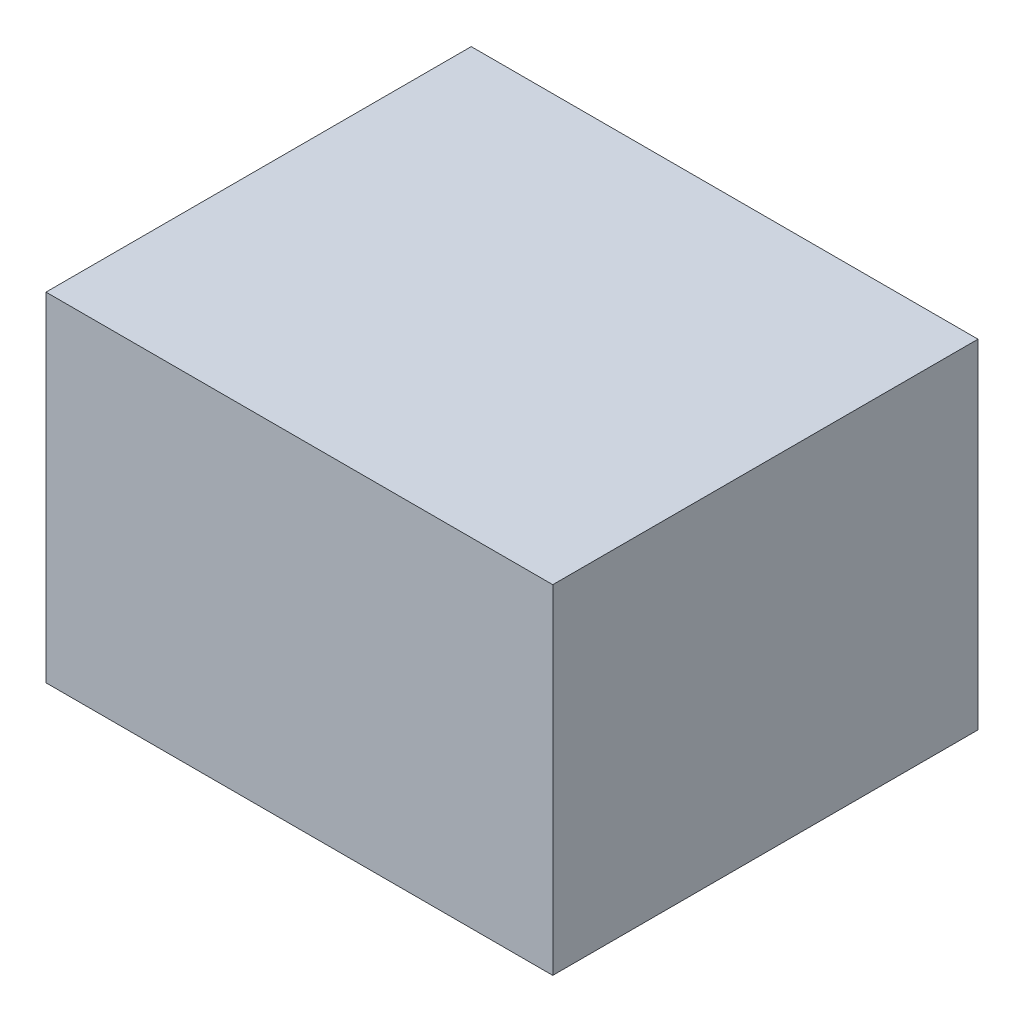
ISO-10303-21;
HEADER;
FILE_DESCRIPTION(('STEP AP214'),'2;1');
FILE_NAME('part.step','',(''),(''),'','','');
FILE_SCHEMA(('AUTOMOTIVE_DESIGN { 1 0 10303 214 1 1 1 1 }'));
ENDSEC;
DATA;
#1=APPLICATION_CONTEXT('core data for automotive mechanical design processes');
#2=APPLICATION_PROTOCOL_DEFINITION('international standard','automotive_design',2000,#1);
#3=PRODUCT_CONTEXT('',#1,'mechanical');
#4=PRODUCT('Part','Part','',(#3));
#5=PRODUCT_RELATED_PRODUCT_CATEGORY('part','',(#4));
#6=PRODUCT_DEFINITION_FORMATION('','',#4);
#7=PRODUCT_DEFINITION_CONTEXT('part definition',#1,'design');
#8=PRODUCT_DEFINITION('design','',#6,#7);
#9=PRODUCT_DEFINITION_SHAPE('','',#8);
#10=(LENGTH_UNIT() NAMED_UNIT(*) SI_UNIT(.MILLI.,.METRE.));
#11=(NAMED_UNIT(*) PLANE_ANGLE_UNIT() SI_UNIT($,.RADIAN.));
#12=(NAMED_UNIT(*) SI_UNIT($,.STERADIAN.) SOLID_ANGLE_UNIT());
#13=UNCERTAINTY_MEASURE_WITH_UNIT(LENGTH_MEASURE(1.E-05),#10,'distance_accuracy_value','');
#14=(GEOMETRIC_REPRESENTATION_CONTEXT(3) GLOBAL_UNCERTAINTY_ASSIGNED_CONTEXT((#13)) GLOBAL_UNIT_ASSIGNED_CONTEXT((#10,
#11,#12)) REPRESENTATION_CONTEXT('',''));
#15=CARTESIAN_POINT('',(0.,0.,0.));
#16=DIRECTION('',(0.,0.,1.));
#17=DIRECTION('',(1.,0.,0.));
#18=AXIS2_PLACEMENT_3D('',#15,#16,#17);
#19=CARTESIAN_POINT('',(-2.735405575254,1.29217986081,19.2));
#20=DIRECTION('',(0.,0.,-1.));
#21=DIRECTION('',(0.,-1.,0.));
#22=AXIS2_PLACEMENT_3D('',#19,#20,#21);
#23=PLANE('',#22);
#24=DIRECTION('',(-1.,0.,0.));
#25=VECTOR('',#24,1.);
#26=CARTESIAN_POINT('',(-2.139527219699,0.894293094143,19.2));
#27=LINE('',#26,#25);
#28=CARTESIAN_POINT('',(-2.139527219699,0.894293094143,19.2));
#29=VERTEX_POINT('',#28);
#30=CARTESIAN_POINT('',(-3.33128393081,0.894293094143,19.2));
#31=VERTEX_POINT('',#30);
#32=EDGE_CURVE('E93',#29,#31,#27,.T.);
#33=ORIENTED_EDGE('',*,*,#32,.T.);
#34=DIRECTION('',(0.,1.,0.));
#35=VECTOR('',#34,1.);
#36=CARTESIAN_POINT('',(-3.33128393081,0.894293094143,19.2));
#37=LINE('',#36,#35);
#38=CARTESIAN_POINT('',(-3.33128393081,1.690066627477,19.2));
#39=VERTEX_POINT('',#38);
#40=EDGE_CURVE('E58',#31,#39,#37,.T.);
#41=ORIENTED_EDGE('',*,*,#40,.T.);
#42=DIRECTION('',(1.,0.,0.));
#43=VECTOR('',#42,1.);
#44=CARTESIAN_POINT('',(-3.33128393081,1.690066627477,19.2));
#45=LINE('',#44,#43);
#46=CARTESIAN_POINT('',(-2.139527219699,1.690066627477,19.2));
#47=VERTEX_POINT('',#46);
#48=EDGE_CURVE('E84',#39,#47,#45,.T.);
#49=ORIENTED_EDGE('',*,*,#48,.T.);
#50=DIRECTION('',(0.,-1.,0.));
#51=VECTOR('',#50,1.);
#52=CARTESIAN_POINT('',(-2.139527219699,1.690066627477,19.2));
#53=LINE('',#52,#51);
#54=EDGE_CURVE('E11',#47,#29,#53,.T.);
#55=ORIENTED_EDGE('',*,*,#54,.T.);
#56=EDGE_LOOP('',(#33,#41,#49,#55));
#57=FACE_BOUND('',#56,.T.);
#58=ADVANCED_FACE('F16',(#57),#23,.T.);
#59=CARTESIAN_POINT('',(-2.735405575254,1.29217986081,20.2));
#60=DIRECTION('',(0.,0.,-1.));
#61=DIRECTION('',(0.,-1.,0.));
#62=AXIS2_PLACEMENT_3D('',#59,#60,#61);
#63=PLANE('',#62);
#64=DIRECTION('',(-1.,0.,0.));
#65=VECTOR('',#64,1.);
#66=CARTESIAN_POINT('',(-2.139527219699,0.894293094143,20.2));
#67=LINE('',#66,#65);
#68=CARTESIAN_POINT('',(-2.139527219699,0.894293094143,20.2));
#69=VERTEX_POINT('',#68);
#70=CARTESIAN_POINT('',(-3.33128393081,0.894293094143,20.2));
#71=VERTEX_POINT('',#70);
#72=EDGE_CURVE('E86',#69,#71,#67,.T.);
#73=ORIENTED_EDGE('',*,*,#72,.F.);
#74=DIRECTION('',(0.,-1.,0.));
#75=VECTOR('',#74,1.);
#76=CARTESIAN_POINT('',(-2.139527219699,1.690066627477,20.2));
#77=LINE('',#76,#75);
#78=CARTESIAN_POINT('',(-2.139527219699,1.690066627477,20.2));
#79=VERTEX_POINT('',#78);
#80=EDGE_CURVE('E20',#79,#69,#77,.T.);
#81=ORIENTED_EDGE('',*,*,#80,.F.);
#82=DIRECTION('',(1.,0.,0.));
#83=VECTOR('',#82,1.);
#84=CARTESIAN_POINT('',(-3.33128393081,1.690066627477,20.2));
#85=LINE('',#84,#83);
#86=CARTESIAN_POINT('',(-3.33128393081,1.690066627477,20.2));
#87=VERTEX_POINT('',#86);
#88=EDGE_CURVE('E107',#87,#79,#85,.T.);
#89=ORIENTED_EDGE('',*,*,#88,.F.);
#90=DIRECTION('',(0.,1.,0.));
#91=VECTOR('',#90,1.);
#92=CARTESIAN_POINT('',(-3.33128393081,0.894293094143,20.2));
#93=LINE('',#92,#91);
#94=EDGE_CURVE('E68',#71,#87,#93,.T.);
#95=ORIENTED_EDGE('',*,*,#94,.F.);
#96=EDGE_LOOP('',(#73,#81,#89,#95));
#97=FACE_BOUND('',#96,.T.);
#98=ADVANCED_FACE('F18',(#97),#63,.F.);
#99=CARTESIAN_POINT('',(-2.139527219699,1.29217986081,19.19));
#100=DIRECTION('',(-1.,0.,0.));
#101=DIRECTION('',(0.,0.,1.));
#102=AXIS2_PLACEMENT_3D('',#99,#100,#101);
#103=PLANE('',#102);
#104=DIRECTION('',(0.,0.,-1.));
#105=VECTOR('',#104,1.);
#106=CARTESIAN_POINT('',(-2.139527219699,1.690066627477,20.2));
#107=LINE('',#106,#105);
#108=EDGE_CURVE('E81',#79,#47,#107,.T.);
#109=ORIENTED_EDGE('',*,*,#108,.F.);
#110=ORIENTED_EDGE('',*,*,#80,.T.);
#111=DIRECTION('',(0.,0.,-1.));
#112=VECTOR('',#111,1.);
#113=CARTESIAN_POINT('',(-2.139527219699,0.894293094143,20.2));
#114=LINE('',#113,#112);
#115=EDGE_CURVE('E79',#69,#29,#114,.T.);
#116=ORIENTED_EDGE('',*,*,#115,.T.);
#117=ORIENTED_EDGE('',*,*,#54,.F.);
#118=EDGE_LOOP('',(#109,#110,#116,#117));
#119=FACE_BOUND('',#118,.T.);
#120=ADVANCED_FACE('F77',(#119),#103,.F.);
#121=CARTESIAN_POINT('',(-2.7354055752545,1.690066627477,19.19));
#122=DIRECTION('',(0.,-1.,0.));
#123=DIRECTION('',(0.,0.,-1.));
#124=AXIS2_PLACEMENT_3D('',#121,#122,#123);
#125=PLANE('',#124);
#126=DIRECTION('',(0.,0.,-1.));
#127=VECTOR('',#126,1.);
#128=CARTESIAN_POINT('',(-3.33128393081,1.690066627477,20.2));
#129=LINE('',#128,#127);
#130=EDGE_CURVE('E103',#87,#39,#129,.T.);
#131=ORIENTED_EDGE('',*,*,#130,.F.);
#132=ORIENTED_EDGE('',*,*,#88,.T.);
#133=ORIENTED_EDGE('',*,*,#108,.T.);
#134=ORIENTED_EDGE('',*,*,#48,.F.);
#135=EDGE_LOOP('',(#131,#132,#133,#134));
#136=FACE_BOUND('',#135,.T.);
#137=ADVANCED_FACE('F123',(#136),#125,.F.);
#138=CARTESIAN_POINT('',(-3.33128393081,1.29217986081,19.19));
#139=DIRECTION('',(1.,0.,0.));
#140=DIRECTION('',(0.,1.,0.));
#141=AXIS2_PLACEMENT_3D('',#138,#139,#140);
#142=PLANE('',#141);
#143=DIRECTION('',(0.,0.,-1.));
#144=VECTOR('',#143,1.);
#145=CARTESIAN_POINT('',(-3.33128393081,0.894293094143,20.2));
#146=LINE('',#145,#144);
#147=EDGE_CURVE('E90',#71,#31,#146,.T.);
#148=ORIENTED_EDGE('',*,*,#147,.F.);
#149=ORIENTED_EDGE('',*,*,#94,.T.);
#150=ORIENTED_EDGE('',*,*,#130,.T.);
#151=ORIENTED_EDGE('',*,*,#40,.F.);
#152=EDGE_LOOP('',(#148,#149,#150,#151));
#153=FACE_BOUND('',#152,.T.);
#154=ADVANCED_FACE('F119',(#153),#142,.F.);
#155=CARTESIAN_POINT('',(-2.7354055752545,0.894293094143,19.19));
#156=DIRECTION('',(0.,1.,0.));
#157=DIRECTION('',(1.,0.,0.));
#158=AXIS2_PLACEMENT_3D('',#155,#156,#157);
#159=PLANE('',#158);
#160=ORIENTED_EDGE('',*,*,#115,.F.);
#161=ORIENTED_EDGE('',*,*,#72,.T.);
#162=ORIENTED_EDGE('',*,*,#147,.T.);
#163=ORIENTED_EDGE('',*,*,#32,.F.);
#164=EDGE_LOOP('',(#160,#161,#162,#163));
#165=FACE_BOUND('',#164,.T.);
#166=ADVANCED_FACE('F92',(#165),#159,.F.);
#167=CLOSED_SHELL('',(#58,#98,#120,#137,#154,#166));
#168=MANIFOLD_SOLID_BREP('B1',#167);
#169=ADVANCED_BREP_SHAPE_REPRESENTATION('',(#18,#168),#14);
#170=SHAPE_DEFINITION_REPRESENTATION(#9,#169);
ENDSEC;
END-ISO-10303-21;
